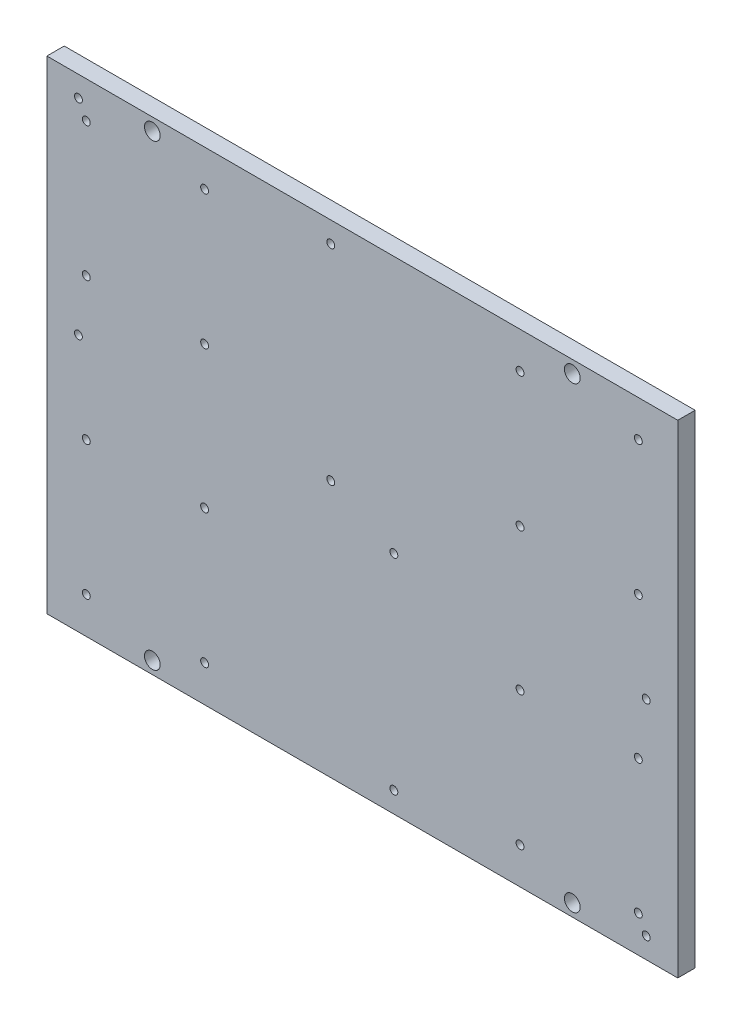
ISO-10303-21;
HEADER;
FILE_DESCRIPTION(('STEP AP214'),'2;1');
FILE_NAME('part.step','',(''),(''),'','','');
FILE_SCHEMA(('AUTOMOTIVE_DESIGN { 1 0 10303 214 1 1 1 1 }'));
ENDSEC;
DATA;
#1=APPLICATION_CONTEXT('core data for automotive mechanical design processes');
#2=APPLICATION_PROTOCOL_DEFINITION('international standard','automotive_design',2000,#1);
#3=PRODUCT_CONTEXT('',#1,'mechanical');
#4=PRODUCT('Part','Part','',(#3));
#5=PRODUCT_RELATED_PRODUCT_CATEGORY('part','',(#4));
#6=PRODUCT_DEFINITION_FORMATION('','',#4);
#7=PRODUCT_DEFINITION_CONTEXT('part definition',#1,'design');
#8=PRODUCT_DEFINITION('design','',#6,#7);
#9=PRODUCT_DEFINITION_SHAPE('','',#8);
#10=(LENGTH_UNIT() NAMED_UNIT(*) SI_UNIT(.MILLI.,.METRE.));
#11=(NAMED_UNIT(*) PLANE_ANGLE_UNIT() SI_UNIT($,.RADIAN.));
#12=(NAMED_UNIT(*) SI_UNIT($,.STERADIAN.) SOLID_ANGLE_UNIT());
#13=UNCERTAINTY_MEASURE_WITH_UNIT(LENGTH_MEASURE(1.E-05),#10,'distance_accuracy_value','');
#14=(GEOMETRIC_REPRESENTATION_CONTEXT(3) GLOBAL_UNCERTAINTY_ASSIGNED_CONTEXT((#13)) GLOBAL_UNIT_ASSIGNED_CONTEXT((#10,
#11,#12)) REPRESENTATION_CONTEXT('',''));
#15=CARTESIAN_POINT('',(0.,0.,0.));
#16=DIRECTION('',(0.,0.,1.));
#17=DIRECTION('',(1.,0.,0.));
#18=AXIS2_PLACEMENT_3D('',#15,#16,#17);
#19=CARTESIAN_POINT('',(101.6,-77.7875,5.588));
#20=DIRECTION('',(-1.,0.,0.));
#21=DIRECTION('',(0.,0.,1.));
#22=AXIS2_PLACEMENT_3D('',#19,#20,#21);
#23=PLANE('',#22);
#24=DIRECTION('',(0.,1.,0.));
#25=VECTOR('',#24,1.);
#26=CARTESIAN_POINT('',(101.6,-77.7875,0.));
#27=LINE('',#26,#25);
#28=CARTESIAN_POINT('',(101.6,-77.7875,0.));
#29=VERTEX_POINT('',#28);
#30=CARTESIAN_POINT('',(101.6,77.7875,0.));
#31=VERTEX_POINT('',#30);
#32=EDGE_CURVE('E94',#29,#31,#27,.T.);
#33=ORIENTED_EDGE('',*,*,#32,.T.);
#34=DIRECTION('',(0.,0.,-1.));
#35=VECTOR('',#34,1.);
#36=CARTESIAN_POINT('',(101.6,77.7875,5.588));
#37=LINE('',#36,#35);
#38=CARTESIAN_POINT('',(101.6,77.7875,5.588));
#39=VERTEX_POINT('',#38);
#40=EDGE_CURVE('E11',#39,#31,#37,.T.);
#41=ORIENTED_EDGE('',*,*,#40,.F.);
#42=DIRECTION('',(0.,1.,0.));
#43=VECTOR('',#42,1.);
#44=CARTESIAN_POINT('',(101.6,-77.7875,5.588));
#45=LINE('',#44,#43);
#46=CARTESIAN_POINT('',(101.6,-77.7875,5.588));
#47=VERTEX_POINT('',#46);
#48=EDGE_CURVE('E82',#47,#39,#45,.T.);
#49=ORIENTED_EDGE('',*,*,#48,.F.);
#50=DIRECTION('',(0.,0.,-1.));
#51=VECTOR('',#50,1.);
#52=CARTESIAN_POINT('',(101.6,-77.7875,5.588));
#53=LINE('',#52,#51);
#54=EDGE_CURVE('E90',#47,#29,#53,.T.);
#55=ORIENTED_EDGE('',*,*,#54,.T.);
#56=EDGE_LOOP('',(#33,#41,#49,#55));
#57=FACE_BOUND('',#56,.T.);
#58=ADVANCED_FACE('F31',(#57),#23,.F.);
#59=CARTESIAN_POINT('',(-101.6,77.7875,5.588));
#60=DIRECTION('',(0.,-1.,0.));
#61=DIRECTION('',(0.,0.,-1.));
#62=AXIS2_PLACEMENT_3D('',#59,#60,#61);
#63=PLANE('',#62);
#64=DIRECTION('',(-1.,0.,0.));
#65=VECTOR('',#64,1.);
#66=CARTESIAN_POINT('',(-101.6,77.7875,0.));
#67=LINE('',#66,#65);
#68=CARTESIAN_POINT('',(-101.6,77.7875,0.));
#69=VERTEX_POINT('',#68);
#70=EDGE_CURVE('E86',#31,#69,#67,.T.);
#71=ORIENTED_EDGE('',*,*,#70,.T.);
#72=DIRECTION('',(0.,0.,-1.));
#73=VECTOR('',#72,1.);
#74=CARTESIAN_POINT('',(-101.6,77.7875,5.588));
#75=LINE('',#74,#73);
#76=CARTESIAN_POINT('',(-101.6,77.7875,5.588));
#77=VERTEX_POINT('',#76);
#78=EDGE_CURVE('E39',#77,#69,#75,.T.);
#79=ORIENTED_EDGE('',*,*,#78,.F.);
#80=DIRECTION('',(-1.,0.,0.));
#81=VECTOR('',#80,1.);
#82=CARTESIAN_POINT('',(-101.6,77.7875,5.588));
#83=LINE('',#82,#81);
#84=EDGE_CURVE('E77',#39,#77,#83,.T.);
#85=ORIENTED_EDGE('',*,*,#84,.F.);
#86=ORIENTED_EDGE('',*,*,#40,.T.);
#87=EDGE_LOOP('',(#71,#79,#85,#86));
#88=FACE_BOUND('',#87,.T.);
#89=ADVANCED_FACE('F85',(#88),#63,.F.);
#90=CARTESIAN_POINT('',(-101.6,-77.7875,5.588));
#91=DIRECTION('',(1.,0.,0.));
#92=DIRECTION('',(0.,0.,-1.));
#93=AXIS2_PLACEMENT_3D('',#90,#91,#92);
#94=PLANE('',#93);
#95=DIRECTION('',(0.,-1.,0.));
#96=VECTOR('',#95,1.);
#97=CARTESIAN_POINT('',(-101.6,-77.7875,0.));
#98=LINE('',#97,#96);
#99=CARTESIAN_POINT('',(-101.6,-77.7875,0.));
#100=VERTEX_POINT('',#99);
#101=EDGE_CURVE('E64',#69,#100,#98,.T.);
#102=ORIENTED_EDGE('',*,*,#101,.T.);
#103=DIRECTION('',(0.,0.,-1.));
#104=VECTOR('',#103,1.);
#105=CARTESIAN_POINT('',(-101.6,-77.7875,5.588));
#106=LINE('',#105,#104);
#107=CARTESIAN_POINT('',(-101.6,-77.7875,5.588));
#108=VERTEX_POINT('',#107);
#109=EDGE_CURVE('E87',#108,#100,#106,.T.);
#110=ORIENTED_EDGE('',*,*,#109,.F.);
#111=DIRECTION('',(0.,-1.,0.));
#112=VECTOR('',#111,1.);
#113=CARTESIAN_POINT('',(-101.6,-77.7875,5.588));
#114=LINE('',#113,#112);
#115=EDGE_CURVE('E80',#77,#108,#114,.T.);
#116=ORIENTED_EDGE('',*,*,#115,.F.);
#117=ORIENTED_EDGE('',*,*,#78,.T.);
#118=EDGE_LOOP('',(#102,#110,#116,#117));
#119=FACE_BOUND('',#118,.T.);
#120=ADVANCED_FACE('F88',(#119),#94,.F.);
#121=CARTESIAN_POINT('',(-101.6,-77.7875,5.588));
#122=DIRECTION('',(0.,1.,0.));
#123=DIRECTION('',(0.,0.,1.));
#124=AXIS2_PLACEMENT_3D('',#121,#122,#123);
#125=PLANE('',#124);
#126=DIRECTION('',(1.,0.,0.));
#127=VECTOR('',#126,1.);
#128=CARTESIAN_POINT('',(-101.6,-77.7875,0.));
#129=LINE('',#128,#127);
#130=EDGE_CURVE('E70',#100,#29,#129,.T.);
#131=ORIENTED_EDGE('',*,*,#130,.T.);
#132=ORIENTED_EDGE('',*,*,#54,.F.);
#133=DIRECTION('',(1.,0.,0.));
#134=VECTOR('',#133,1.);
#135=CARTESIAN_POINT('',(-101.6,-77.7875,5.588));
#136=LINE('',#135,#134);
#137=EDGE_CURVE('E47',#108,#47,#136,.T.);
#138=ORIENTED_EDGE('',*,*,#137,.F.);
#139=ORIENTED_EDGE('',*,*,#109,.T.);
#140=EDGE_LOOP('',(#131,#132,#138,#139));
#141=FACE_BOUND('',#140,.T.);
#142=ADVANCED_FACE('F102',(#141),#125,.F.);
#143=CARTESIAN_POINT('',(101.6,77.7875,5.588));
#144=DIRECTION('',(0.,0.,-1.));
#145=DIRECTION('',(-1.,0.,0.));
#146=AXIS2_PLACEMENT_3D('',#143,#144,#145);
#147=PLANE('',#146);
#148=CARTESIAN_POINT('',(50.7999999999999,-22.86,5.588));
#149=DIRECTION('',(0.,0.,1.));
#150=DIRECTION('',(-1.,0.,0.));
#151=AXIS2_PLACEMENT_3D('',#148,#149,#150);
#152=CIRCLE('',#151,1.27);
#153=CARTESIAN_POINT('',(49.53,-22.86,5.588));
#154=VERTEX_POINT('',#153);
#155=EDGE_CURVE('E270',#154,#154,#152,.T.);
#156=ORIENTED_EDGE('',*,*,#155,.F.);
#157=EDGE_LOOP('',(#156));
#158=FACE_BOUND('',#157,.T.);
#159=CARTESIAN_POINT('',(50.8,-66.04,5.588));
#160=DIRECTION('',(0.,0.,1.));
#161=DIRECTION('',(-1.,0.,0.));
#162=AXIS2_PLACEMENT_3D('',#159,#160,#161);
#163=CIRCLE('',#162,1.27);
#164=CARTESIAN_POINT('',(49.53,-66.04,5.588));
#165=VERTEX_POINT('',#164);
#166=EDGE_CURVE('E264',#165,#165,#163,.T.);
#167=ORIENTED_EDGE('',*,*,#166,.F.);
#168=EDGE_LOOP('',(#167));
#169=FACE_BOUND('',#168,.T.);
#170=CARTESIAN_POINT('',(88.8999999999999,-66.04,5.588));
#171=DIRECTION('',(0.,0.,1.));
#172=DIRECTION('',(-1.,0.,0.));
#173=AXIS2_PLACEMENT_3D('',#170,#171,#172);
#174=CIRCLE('',#173,1.26999999999999);
#175=CARTESIAN_POINT('',(87.63,-66.04,5.588));
#176=VERTEX_POINT('',#175);
#177=EDGE_CURVE('E258',#176,#176,#174,.T.);
#178=ORIENTED_EDGE('',*,*,#177,.F.);
#179=EDGE_LOOP('',(#178));
#180=FACE_BOUND('',#179,.T.);
#181=CARTESIAN_POINT('',(88.8999999999999,22.86,5.588));
#182=DIRECTION('',(0.,0.,1.));
#183=DIRECTION('',(1.,0.,0.));
#184=AXIS2_PLACEMENT_3D('',#181,#182,#183);
#185=CIRCLE('',#184,1.26999999999999);
#186=CARTESIAN_POINT('',(90.1699999999999,22.86,5.588));
#187=VERTEX_POINT('',#186);
#188=EDGE_CURVE('E252',#187,#187,#185,.T.);
#189=ORIENTED_EDGE('',*,*,#188,.F.);
#190=EDGE_LOOP('',(#189));
#191=FACE_BOUND('',#190,.T.);
#192=CARTESIAN_POINT('',(-88.8999999999999,-22.8600000000001,5.588));
#193=DIRECTION('',(0.,0.,1.));
#194=DIRECTION('',(1.,0.,0.));
#195=AXIS2_PLACEMENT_3D('',#192,#193,#194);
#196=CIRCLE('',#195,1.26999999999999);
#197=CARTESIAN_POINT('',(-87.6299999999999,-22.8600000000001,5.588));
#198=VERTEX_POINT('',#197);
#199=EDGE_CURVE('E246',#198,#198,#196,.T.);
#200=ORIENTED_EDGE('',*,*,#199,.F.);
#201=EDGE_LOOP('',(#200));
#202=FACE_BOUND('',#201,.T.);
#203=CARTESIAN_POINT('',(-88.8999999999999,-66.04,5.588));
#204=DIRECTION('',(0.,0.,1.));
#205=DIRECTION('',(1.,0.,0.));
#206=AXIS2_PLACEMENT_3D('',#203,#204,#205);
#207=CIRCLE('',#206,1.26999999999999);
#208=CARTESIAN_POINT('',(-87.6299999999999,-66.04,5.588));
#209=VERTEX_POINT('',#208);
#210=EDGE_CURVE('E240',#209,#209,#207,.T.);
#211=ORIENTED_EDGE('',*,*,#210,.F.);
#212=EDGE_LOOP('',(#211));
#213=FACE_BOUND('',#212,.T.);
#214=CARTESIAN_POINT('',(-50.7999999999999,-66.04,5.588));
#215=DIRECTION('',(0.,0.,1.));
#216=DIRECTION('',(1.,0.,0.));
#217=AXIS2_PLACEMENT_3D('',#214,#215,#216);
#218=CIRCLE('',#217,1.27);
#219=CARTESIAN_POINT('',(-49.5299999999999,-66.04,5.588));
#220=VERTEX_POINT('',#219);
#221=EDGE_CURVE('E234',#220,#220,#218,.T.);
#222=ORIENTED_EDGE('',*,*,#221,.F.);
#223=EDGE_LOOP('',(#222));
#224=FACE_BOUND('',#223,.T.);
#225=CARTESIAN_POINT('',(-50.7999999999999,-22.86,5.588));
#226=DIRECTION('',(0.,0.,1.));
#227=DIRECTION('',(1.,0.,0.));
#228=AXIS2_PLACEMENT_3D('',#225,#226,#227);
#229=CIRCLE('',#228,1.27);
#230=CARTESIAN_POINT('',(-49.5299999999999,-22.86,5.588));
#231=VERTEX_POINT('',#230);
#232=EDGE_CURVE('E228',#231,#231,#229,.T.);
#233=ORIENTED_EDGE('',*,*,#232,.F.);
#234=EDGE_LOOP('',(#233));
#235=FACE_BOUND('',#234,.T.);
#236=CARTESIAN_POINT('',(88.8999999999999,-22.86,5.588));
#237=DIRECTION('',(0.,0.,1.));
#238=DIRECTION('',(-1.,0.,0.));
#239=AXIS2_PLACEMENT_3D('',#236,#237,#238);
#240=CIRCLE('',#239,1.26999999999999);
#241=CARTESIAN_POINT('',(87.6299999999999,-22.86,5.588));
#242=VERTEX_POINT('',#241);
#243=EDGE_CURVE('E222',#242,#242,#240,.T.);
#244=ORIENTED_EDGE('',*,*,#243,.F.);
#245=EDGE_LOOP('',(#244));
#246=FACE_BOUND('',#245,.T.);
#247=CARTESIAN_POINT('',(-50.7999999999999,22.86,5.588));
#248=DIRECTION('',(0.,0.,1.));
#249=DIRECTION('',(-1.,0.,0.));
#250=AXIS2_PLACEMENT_3D('',#247,#248,#249);
#251=CIRCLE('',#250,1.27);
#252=CARTESIAN_POINT('',(-52.0699999999999,22.86,5.588));
#253=VERTEX_POINT('',#252);
#254=EDGE_CURVE('E216',#253,#253,#251,.T.);
#255=ORIENTED_EDGE('',*,*,#254,.F.);
#256=EDGE_LOOP('',(#255));
#257=FACE_BOUND('',#256,.T.);
#258=CARTESIAN_POINT('',(-50.7999999999999,66.04,5.588));
#259=DIRECTION('',(0.,0.,1.));
#260=DIRECTION('',(-1.,0.,0.));
#261=AXIS2_PLACEMENT_3D('',#258,#259,#260);
#262=CIRCLE('',#261,1.27);
#263=CARTESIAN_POINT('',(-52.0699999999999,66.04,5.588));
#264=VERTEX_POINT('',#263);
#265=EDGE_CURVE('E210',#264,#264,#262,.T.);
#266=ORIENTED_EDGE('',*,*,#265,.F.);
#267=EDGE_LOOP('',(#266));
#268=FACE_BOUND('',#267,.T.);
#269=CARTESIAN_POINT('',(-88.8999999999999,66.04,5.588));
#270=DIRECTION('',(0.,0.,1.));
#271=DIRECTION('',(-1.,0.,0.));
#272=AXIS2_PLACEMENT_3D('',#269,#270,#271);
#273=CIRCLE('',#272,1.26999999999999);
#274=CARTESIAN_POINT('',(-90.1699999999999,66.04,5.588));
#275=VERTEX_POINT('',#274);
#276=EDGE_CURVE('E204',#275,#275,#273,.T.);
#277=ORIENTED_EDGE('',*,*,#276,.F.);
#278=EDGE_LOOP('',(#277));
#279=FACE_BOUND('',#278,.T.);
#280=CARTESIAN_POINT('',(-88.8999999999999,22.86,5.588));
#281=DIRECTION('',(0.,0.,1.));
#282=DIRECTION('',(-1.,0.,0.));
#283=AXIS2_PLACEMENT_3D('',#280,#281,#282);
#284=CIRCLE('',#283,1.26999999999999);
#285=CARTESIAN_POINT('',(-90.1699999999999,22.86,5.588));
#286=VERTEX_POINT('',#285);
#287=EDGE_CURVE('E198',#286,#286,#284,.T.);
#288=ORIENTED_EDGE('',*,*,#287,.F.);
#289=EDGE_LOOP('',(#288));
#290=FACE_BOUND('',#289,.T.);
#291=CARTESIAN_POINT('',(88.8999999999999,66.04,5.588));
#292=DIRECTION('',(0.,0.,1.));
#293=DIRECTION('',(1.,0.,0.));
#294=AXIS2_PLACEMENT_3D('',#291,#292,#293);
#295=CIRCLE('',#294,1.26999999999999);
#296=CARTESIAN_POINT('',(90.1699999999999,66.04,5.588));
#297=VERTEX_POINT('',#296);
#298=EDGE_CURVE('E192',#297,#297,#295,.T.);
#299=ORIENTED_EDGE('',*,*,#298,.F.);
#300=EDGE_LOOP('',(#299));
#301=FACE_BOUND('',#300,.T.);
#302=CARTESIAN_POINT('',(50.7999999999999,66.04,5.588));
#303=DIRECTION('',(0.,0.,1.));
#304=DIRECTION('',(1.,0.,0.));
#305=AXIS2_PLACEMENT_3D('',#302,#303,#304);
#306=CIRCLE('',#305,1.27);
#307=CARTESIAN_POINT('',(52.0699999999999,66.04,5.588));
#308=VERTEX_POINT('',#307);
#309=EDGE_CURVE('E186',#308,#308,#306,.T.);
#310=ORIENTED_EDGE('',*,*,#309,.F.);
#311=EDGE_LOOP('',(#310));
#312=FACE_BOUND('',#311,.T.);
#313=CARTESIAN_POINT('',(50.7999999999999,22.86,5.588));
#314=DIRECTION('',(0.,0.,1.));
#315=DIRECTION('',(1.,0.,0.));
#316=AXIS2_PLACEMENT_3D('',#313,#314,#315);
#317=CIRCLE('',#316,1.27);
#318=CARTESIAN_POINT('',(52.0699999999999,22.86,5.588));
#319=VERTEX_POINT('',#318);
#320=EDGE_CURVE('E180',#319,#319,#317,.T.);
#321=ORIENTED_EDGE('',*,*,#320,.F.);
#322=EDGE_LOOP('',(#321));
#323=FACE_BOUND('',#322,.T.);
#324=CARTESIAN_POINT('',(10.16,-71.12,5.588));
#325=DIRECTION('',(0.,0.,1.));
#326=DIRECTION('',(1.,0.,0.));
#327=AXIS2_PLACEMENT_3D('',#324,#325,#326);
#328=CIRCLE('',#327,1.27);
#329=CARTESIAN_POINT('',(11.43,-71.12,5.588));
#330=VERTEX_POINT('',#329);
#331=EDGE_CURVE('E174',#330,#330,#328,.T.);
#332=ORIENTED_EDGE('',*,*,#331,.F.);
#333=EDGE_LOOP('',(#332));
#334=FACE_BOUND('',#333,.T.);
#335=CARTESIAN_POINT('',(91.44,-71.12,5.588));
#336=DIRECTION('',(0.,0.,1.));
#337=DIRECTION('',(1.,0.,0.));
#338=AXIS2_PLACEMENT_3D('',#335,#336,#337);
#339=CIRCLE('',#338,1.27000000000001);
#340=CARTESIAN_POINT('',(92.71,-71.12,5.588));
#341=VERTEX_POINT('',#340);
#342=EDGE_CURVE('E168',#341,#341,#339,.T.);
#343=ORIENTED_EDGE('',*,*,#342,.F.);
#344=EDGE_LOOP('',(#343));
#345=FACE_BOUND('',#344,.T.);
#346=CARTESIAN_POINT('',(91.44,-5.08,5.588));
#347=DIRECTION('',(0.,0.,1.));
#348=DIRECTION('',(1.,0.,0.));
#349=AXIS2_PLACEMENT_3D('',#346,#347,#348);
#350=CIRCLE('',#349,1.27000000000001);
#351=CARTESIAN_POINT('',(92.71,-5.08,5.588));
#352=VERTEX_POINT('',#351);
#353=EDGE_CURVE('E162',#352,#352,#350,.T.);
#354=ORIENTED_EDGE('',*,*,#353,.F.);
#355=EDGE_LOOP('',(#354));
#356=FACE_BOUND('',#355,.T.);
#357=CARTESIAN_POINT('',(10.16,-5.08,5.588));
#358=DIRECTION('',(0.,0.,1.));
#359=DIRECTION('',(1.,0.,0.));
#360=AXIS2_PLACEMENT_3D('',#357,#358,#359);
#361=CIRCLE('',#360,1.26999999999999);
#362=CARTESIAN_POINT('',(11.43,-5.08,5.588));
#363=VERTEX_POINT('',#362);
#364=EDGE_CURVE('E156',#363,#363,#361,.T.);
#365=ORIENTED_EDGE('',*,*,#364,.F.);
#366=EDGE_LOOP('',(#365));
#367=FACE_BOUND('',#366,.T.);
#368=CARTESIAN_POINT('',(-91.44,5.08,5.588));
#369=DIRECTION('',(0.,0.,1.));
#370=DIRECTION('',(1.,0.,0.));
#371=AXIS2_PLACEMENT_3D('',#368,#369,#370);
#372=CIRCLE('',#371,1.26999999999999);
#373=CARTESIAN_POINT('',(-90.17,5.08,5.588));
#374=VERTEX_POINT('',#373);
#375=EDGE_CURVE('E150',#374,#374,#372,.T.);
#376=ORIENTED_EDGE('',*,*,#375,.F.);
#377=EDGE_LOOP('',(#376));
#378=FACE_BOUND('',#377,.T.);
#379=CARTESIAN_POINT('',(-10.16,5.08000000000001,5.588));
#380=DIRECTION('',(0.,0.,1.));
#381=DIRECTION('',(1.,0.,0.));
#382=AXIS2_PLACEMENT_3D('',#379,#380,#381);
#383=CIRCLE('',#382,1.27);
#384=CARTESIAN_POINT('',(-8.88999999999998,5.08000000000001,5.588));
#385=VERTEX_POINT('',#384);
#386=EDGE_CURVE('E144',#385,#385,#383,.T.);
#387=ORIENTED_EDGE('',*,*,#386,.F.);
#388=EDGE_LOOP('',(#387));
#389=FACE_BOUND('',#388,.T.);
#390=CARTESIAN_POINT('',(-10.16,71.12,5.588));
#391=DIRECTION('',(0.,0.,1.));
#392=DIRECTION('',(1.,0.,0.));
#393=AXIS2_PLACEMENT_3D('',#390,#391,#392);
#394=CIRCLE('',#393,1.27000000000001);
#395=CARTESIAN_POINT('',(-8.88999999999998,71.12,5.588));
#396=VERTEX_POINT('',#395);
#397=EDGE_CURVE('E138',#396,#396,#394,.T.);
#398=ORIENTED_EDGE('',*,*,#397,.F.);
#399=EDGE_LOOP('',(#398));
#400=FACE_BOUND('',#399,.T.);
#401=CARTESIAN_POINT('',(-91.44,71.12,5.588));
#402=DIRECTION('',(0.,0.,1.));
#403=DIRECTION('',(1.,0.,0.));
#404=AXIS2_PLACEMENT_3D('',#401,#402,#403);
#405=CIRCLE('',#404,1.26999999999999);
#406=CARTESIAN_POINT('',(-90.17,71.12,5.588));
#407=VERTEX_POINT('',#406);
#408=EDGE_CURVE('E132',#407,#407,#405,.T.);
#409=ORIENTED_EDGE('',*,*,#408,.F.);
#410=EDGE_LOOP('',(#409));
#411=FACE_BOUND('',#410,.T.);
#412=CARTESIAN_POINT('',(-67.6275,-73.787,5.588));
#413=DIRECTION('',(0.,0.,1.));
#414=DIRECTION('',(-1.,0.,0.));
#415=AXIS2_PLACEMENT_3D('',#412,#413,#414);
#416=CIRCLE('',#415,2.53999999999999);
#417=CARTESIAN_POINT('',(-70.1675,-73.787,5.588));
#418=VERTEX_POINT('',#417);
#419=EDGE_CURVE('E126',#418,#418,#416,.T.);
#420=ORIENTED_EDGE('',*,*,#419,.F.);
#421=EDGE_LOOP('',(#420));
#422=FACE_BOUND('',#421,.T.);
#423=CARTESIAN_POINT('',(67.6275,-73.787,5.588));
#424=DIRECTION('',(0.,0.,1.));
#425=DIRECTION('',(1.,0.,0.));
#426=AXIS2_PLACEMENT_3D('',#423,#424,#425);
#427=CIRCLE('',#426,2.53999999999999);
#428=CARTESIAN_POINT('',(70.1675,-73.787,5.588));
#429=VERTEX_POINT('',#428);
#430=EDGE_CURVE('E120',#429,#429,#427,.T.);
#431=ORIENTED_EDGE('',*,*,#430,.F.);
#432=EDGE_LOOP('',(#431));
#433=FACE_BOUND('',#432,.T.);
#434=CARTESIAN_POINT('',(67.6275,73.787,5.588));
#435=DIRECTION('',(0.,0.,1.));
#436=DIRECTION('',(-1.,0.,0.));
#437=AXIS2_PLACEMENT_3D('',#434,#435,#436);
#438=CIRCLE('',#437,2.53999999999999);
#439=CARTESIAN_POINT('',(65.0875,73.787,5.588));
#440=VERTEX_POINT('',#439);
#441=EDGE_CURVE('E114',#440,#440,#438,.T.);
#442=ORIENTED_EDGE('',*,*,#441,.F.);
#443=EDGE_LOOP('',(#442));
#444=FACE_BOUND('',#443,.T.);
#445=CARTESIAN_POINT('',(-67.6275,73.787,5.588));
#446=DIRECTION('',(0.,0.,1.));
#447=DIRECTION('',(1.,0.,0.));
#448=AXIS2_PLACEMENT_3D('',#445,#446,#447);
#449=CIRCLE('',#448,2.53999999999999);
#450=CARTESIAN_POINT('',(-65.0875,73.787,5.588));
#451=VERTEX_POINT('',#450);
#452=EDGE_CURVE('E108',#451,#451,#449,.T.);
#453=ORIENTED_EDGE('',*,*,#452,.F.);
#454=EDGE_LOOP('',(#453));
#455=FACE_BOUND('',#454,.T.);
#456=ORIENTED_EDGE('',*,*,#48,.T.);
#457=ORIENTED_EDGE('',*,*,#84,.T.);
#458=ORIENTED_EDGE('',*,*,#115,.T.);
#459=ORIENTED_EDGE('',*,*,#137,.T.);
#460=EDGE_LOOP('',(#456,#457,#458,#459));
#461=FACE_BOUND('',#460,.T.);
#462=ADVANCED_FACE('F78',(#158,#169,#180,#191,#202,#213,#224,#235,#246,#257,#268,#279,#290,#301,
#312,#323,#334,#345,#356,#367,#378,#389,#400,#411,#422,#433,#444,#455,#461),#147,.F.);
#463=CARTESIAN_POINT('',(101.6,77.7875,0.));
#464=DIRECTION('',(0.,0.,-1.));
#465=DIRECTION('',(-1.,0.,0.));
#466=AXIS2_PLACEMENT_3D('',#463,#464,#465);
#467=PLANE('',#466);
#468=CARTESIAN_POINT('',(50.7999999999999,-22.86,0.));
#469=DIRECTION('',(0.,0.,1.));
#470=DIRECTION('',(-1.,0.,0.));
#471=AXIS2_PLACEMENT_3D('',#468,#469,#470);
#472=CIRCLE('',#471,1.27);
#473=CARTESIAN_POINT('',(49.53,-22.86,0.));
#474=VERTEX_POINT('',#473);
#475=EDGE_CURVE('E267',#474,#474,#472,.T.);
#476=ORIENTED_EDGE('',*,*,#475,.T.);
#477=EDGE_LOOP('',(#476));
#478=FACE_BOUND('',#477,.T.);
#479=CARTESIAN_POINT('',(50.8,-66.04,0.));
#480=DIRECTION('',(0.,0.,1.));
#481=DIRECTION('',(-1.,0.,0.));
#482=AXIS2_PLACEMENT_3D('',#479,#480,#481);
#483=CIRCLE('',#482,1.27);
#484=CARTESIAN_POINT('',(49.53,-66.04,0.));
#485=VERTEX_POINT('',#484);
#486=EDGE_CURVE('E261',#485,#485,#483,.T.);
#487=ORIENTED_EDGE('',*,*,#486,.T.);
#488=EDGE_LOOP('',(#487));
#489=FACE_BOUND('',#488,.T.);
#490=CARTESIAN_POINT('',(88.8999999999999,-66.04,0.));
#491=DIRECTION('',(0.,0.,1.));
#492=DIRECTION('',(-1.,0.,0.));
#493=AXIS2_PLACEMENT_3D('',#490,#491,#492);
#494=CIRCLE('',#493,1.26999999999999);
#495=CARTESIAN_POINT('',(87.63,-66.04,0.));
#496=VERTEX_POINT('',#495);
#497=EDGE_CURVE('E255',#496,#496,#494,.T.);
#498=ORIENTED_EDGE('',*,*,#497,.T.);
#499=EDGE_LOOP('',(#498));
#500=FACE_BOUND('',#499,.T.);
#501=CARTESIAN_POINT('',(88.8999999999999,22.86,0.));
#502=DIRECTION('',(0.,0.,1.));
#503=DIRECTION('',(1.,0.,0.));
#504=AXIS2_PLACEMENT_3D('',#501,#502,#503);
#505=CIRCLE('',#504,1.26999999999999);
#506=CARTESIAN_POINT('',(90.1699999999999,22.86,0.));
#507=VERTEX_POINT('',#506);
#508=EDGE_CURVE('E249',#507,#507,#505,.T.);
#509=ORIENTED_EDGE('',*,*,#508,.T.);
#510=EDGE_LOOP('',(#509));
#511=FACE_BOUND('',#510,.T.);
#512=CARTESIAN_POINT('',(-88.8999999999999,-22.8600000000001,0.));
#513=DIRECTION('',(0.,0.,1.));
#514=DIRECTION('',(1.,0.,0.));
#515=AXIS2_PLACEMENT_3D('',#512,#513,#514);
#516=CIRCLE('',#515,1.26999999999999);
#517=CARTESIAN_POINT('',(-87.6299999999999,-22.8600000000001,0.));
#518=VERTEX_POINT('',#517);
#519=EDGE_CURVE('E243',#518,#518,#516,.T.);
#520=ORIENTED_EDGE('',*,*,#519,.T.);
#521=EDGE_LOOP('',(#520));
#522=FACE_BOUND('',#521,.T.);
#523=CARTESIAN_POINT('',(-88.8999999999999,-66.04,0.));
#524=DIRECTION('',(0.,0.,1.));
#525=DIRECTION('',(1.,0.,0.));
#526=AXIS2_PLACEMENT_3D('',#523,#524,#525);
#527=CIRCLE('',#526,1.26999999999999);
#528=CARTESIAN_POINT('',(-87.6299999999999,-66.04,0.));
#529=VERTEX_POINT('',#528);
#530=EDGE_CURVE('E237',#529,#529,#527,.T.);
#531=ORIENTED_EDGE('',*,*,#530,.T.);
#532=EDGE_LOOP('',(#531));
#533=FACE_BOUND('',#532,.T.);
#534=CARTESIAN_POINT('',(-50.7999999999999,-66.04,0.));
#535=DIRECTION('',(0.,0.,1.));
#536=DIRECTION('',(1.,0.,0.));
#537=AXIS2_PLACEMENT_3D('',#534,#535,#536);
#538=CIRCLE('',#537,1.27);
#539=CARTESIAN_POINT('',(-49.5299999999999,-66.04,0.));
#540=VERTEX_POINT('',#539);
#541=EDGE_CURVE('E231',#540,#540,#538,.T.);
#542=ORIENTED_EDGE('',*,*,#541,.T.);
#543=EDGE_LOOP('',(#542));
#544=FACE_BOUND('',#543,.T.);
#545=CARTESIAN_POINT('',(-50.7999999999999,-22.86,0.));
#546=DIRECTION('',(0.,0.,1.));
#547=DIRECTION('',(1.,0.,0.));
#548=AXIS2_PLACEMENT_3D('',#545,#546,#547);
#549=CIRCLE('',#548,1.27);
#550=CARTESIAN_POINT('',(-49.5299999999999,-22.86,0.));
#551=VERTEX_POINT('',#550);
#552=EDGE_CURVE('E225',#551,#551,#549,.T.);
#553=ORIENTED_EDGE('',*,*,#552,.T.);
#554=EDGE_LOOP('',(#553));
#555=FACE_BOUND('',#554,.T.);
#556=CARTESIAN_POINT('',(88.8999999999999,-22.86,0.));
#557=DIRECTION('',(0.,0.,1.));
#558=DIRECTION('',(-1.,0.,0.));
#559=AXIS2_PLACEMENT_3D('',#556,#557,#558);
#560=CIRCLE('',#559,1.26999999999999);
#561=CARTESIAN_POINT('',(87.6299999999999,-22.86,0.));
#562=VERTEX_POINT('',#561);
#563=EDGE_CURVE('E219',#562,#562,#560,.T.);
#564=ORIENTED_EDGE('',*,*,#563,.T.);
#565=EDGE_LOOP('',(#564));
#566=FACE_BOUND('',#565,.T.);
#567=CARTESIAN_POINT('',(-50.7999999999999,22.86,0.));
#568=DIRECTION('',(0.,0.,1.));
#569=DIRECTION('',(-1.,0.,0.));
#570=AXIS2_PLACEMENT_3D('',#567,#568,#569);
#571=CIRCLE('',#570,1.27);
#572=CARTESIAN_POINT('',(-52.0699999999999,22.86,0.));
#573=VERTEX_POINT('',#572);
#574=EDGE_CURVE('E213',#573,#573,#571,.T.);
#575=ORIENTED_EDGE('',*,*,#574,.T.);
#576=EDGE_LOOP('',(#575));
#577=FACE_BOUND('',#576,.T.);
#578=CARTESIAN_POINT('',(-50.7999999999999,66.04,0.));
#579=DIRECTION('',(0.,0.,1.));
#580=DIRECTION('',(-1.,0.,0.));
#581=AXIS2_PLACEMENT_3D('',#578,#579,#580);
#582=CIRCLE('',#581,1.27);
#583=CARTESIAN_POINT('',(-52.0699999999999,66.04,0.));
#584=VERTEX_POINT('',#583);
#585=EDGE_CURVE('E207',#584,#584,#582,.T.);
#586=ORIENTED_EDGE('',*,*,#585,.T.);
#587=EDGE_LOOP('',(#586));
#588=FACE_BOUND('',#587,.T.);
#589=CARTESIAN_POINT('',(-88.8999999999999,66.04,0.));
#590=DIRECTION('',(0.,0.,1.));
#591=DIRECTION('',(-1.,0.,0.));
#592=AXIS2_PLACEMENT_3D('',#589,#590,#591);
#593=CIRCLE('',#592,1.26999999999999);
#594=CARTESIAN_POINT('',(-90.1699999999999,66.04,0.));
#595=VERTEX_POINT('',#594);
#596=EDGE_CURVE('E201',#595,#595,#593,.T.);
#597=ORIENTED_EDGE('',*,*,#596,.T.);
#598=EDGE_LOOP('',(#597));
#599=FACE_BOUND('',#598,.T.);
#600=CARTESIAN_POINT('',(-88.8999999999999,22.86,0.));
#601=DIRECTION('',(0.,0.,1.));
#602=DIRECTION('',(-1.,0.,0.));
#603=AXIS2_PLACEMENT_3D('',#600,#601,#602);
#604=CIRCLE('',#603,1.26999999999999);
#605=CARTESIAN_POINT('',(-90.1699999999999,22.86,0.));
#606=VERTEX_POINT('',#605);
#607=EDGE_CURVE('E195',#606,#606,#604,.T.);
#608=ORIENTED_EDGE('',*,*,#607,.T.);
#609=EDGE_LOOP('',(#608));
#610=FACE_BOUND('',#609,.T.);
#611=CARTESIAN_POINT('',(88.8999999999999,66.04,0.));
#612=DIRECTION('',(0.,0.,1.));
#613=DIRECTION('',(1.,0.,0.));
#614=AXIS2_PLACEMENT_3D('',#611,#612,#613);
#615=CIRCLE('',#614,1.26999999999999);
#616=CARTESIAN_POINT('',(90.1699999999999,66.04,0.));
#617=VERTEX_POINT('',#616);
#618=EDGE_CURVE('E189',#617,#617,#615,.T.);
#619=ORIENTED_EDGE('',*,*,#618,.T.);
#620=EDGE_LOOP('',(#619));
#621=FACE_BOUND('',#620,.T.);
#622=CARTESIAN_POINT('',(50.7999999999999,66.04,0.));
#623=DIRECTION('',(0.,0.,1.));
#624=DIRECTION('',(1.,0.,0.));
#625=AXIS2_PLACEMENT_3D('',#622,#623,#624);
#626=CIRCLE('',#625,1.27);
#627=CARTESIAN_POINT('',(52.0699999999999,66.04,0.));
#628=VERTEX_POINT('',#627);
#629=EDGE_CURVE('E183',#628,#628,#626,.T.);
#630=ORIENTED_EDGE('',*,*,#629,.T.);
#631=EDGE_LOOP('',(#630));
#632=FACE_BOUND('',#631,.T.);
#633=CARTESIAN_POINT('',(50.7999999999999,22.86,0.));
#634=DIRECTION('',(0.,0.,1.));
#635=DIRECTION('',(1.,0.,0.));
#636=AXIS2_PLACEMENT_3D('',#633,#634,#635);
#637=CIRCLE('',#636,1.27);
#638=CARTESIAN_POINT('',(52.0699999999999,22.86,0.));
#639=VERTEX_POINT('',#638);
#640=EDGE_CURVE('E177',#639,#639,#637,.T.);
#641=ORIENTED_EDGE('',*,*,#640,.T.);
#642=EDGE_LOOP('',(#641));
#643=FACE_BOUND('',#642,.T.);
#644=CARTESIAN_POINT('',(10.16,-71.12,0.));
#645=DIRECTION('',(0.,0.,1.));
#646=DIRECTION('',(1.,0.,0.));
#647=AXIS2_PLACEMENT_3D('',#644,#645,#646);
#648=CIRCLE('',#647,1.27);
#649=CARTESIAN_POINT('',(11.43,-71.12,0.));
#650=VERTEX_POINT('',#649);
#651=EDGE_CURVE('E171',#650,#650,#648,.T.);
#652=ORIENTED_EDGE('',*,*,#651,.T.);
#653=EDGE_LOOP('',(#652));
#654=FACE_BOUND('',#653,.T.);
#655=CARTESIAN_POINT('',(91.44,-71.12,0.));
#656=DIRECTION('',(0.,0.,1.));
#657=DIRECTION('',(1.,0.,0.));
#658=AXIS2_PLACEMENT_3D('',#655,#656,#657);
#659=CIRCLE('',#658,1.27000000000001);
#660=CARTESIAN_POINT('',(92.71,-71.12,0.));
#661=VERTEX_POINT('',#660);
#662=EDGE_CURVE('E165',#661,#661,#659,.T.);
#663=ORIENTED_EDGE('',*,*,#662,.T.);
#664=EDGE_LOOP('',(#663));
#665=FACE_BOUND('',#664,.T.);
#666=CARTESIAN_POINT('',(91.44,-5.08,0.));
#667=DIRECTION('',(0.,0.,1.));
#668=DIRECTION('',(1.,0.,0.));
#669=AXIS2_PLACEMENT_3D('',#666,#667,#668);
#670=CIRCLE('',#669,1.27000000000001);
#671=CARTESIAN_POINT('',(92.71,-5.08,0.));
#672=VERTEX_POINT('',#671);
#673=EDGE_CURVE('E159',#672,#672,#670,.T.);
#674=ORIENTED_EDGE('',*,*,#673,.T.);
#675=EDGE_LOOP('',(#674));
#676=FACE_BOUND('',#675,.T.);
#677=CARTESIAN_POINT('',(10.16,-5.08,0.));
#678=DIRECTION('',(0.,0.,1.));
#679=DIRECTION('',(1.,0.,0.));
#680=AXIS2_PLACEMENT_3D('',#677,#678,#679);
#681=CIRCLE('',#680,1.26999999999999);
#682=CARTESIAN_POINT('',(11.43,-5.08,0.));
#683=VERTEX_POINT('',#682);
#684=EDGE_CURVE('E153',#683,#683,#681,.T.);
#685=ORIENTED_EDGE('',*,*,#684,.T.);
#686=EDGE_LOOP('',(#685));
#687=FACE_BOUND('',#686,.T.);
#688=CARTESIAN_POINT('',(-91.44,5.08,0.));
#689=DIRECTION('',(0.,0.,1.));
#690=DIRECTION('',(1.,0.,0.));
#691=AXIS2_PLACEMENT_3D('',#688,#689,#690);
#692=CIRCLE('',#691,1.26999999999999);
#693=CARTESIAN_POINT('',(-90.17,5.08,0.));
#694=VERTEX_POINT('',#693);
#695=EDGE_CURVE('E147',#694,#694,#692,.T.);
#696=ORIENTED_EDGE('',*,*,#695,.T.);
#697=EDGE_LOOP('',(#696));
#698=FACE_BOUND('',#697,.T.);
#699=CARTESIAN_POINT('',(-10.16,5.08000000000001,0.));
#700=DIRECTION('',(0.,0.,1.));
#701=DIRECTION('',(1.,0.,0.));
#702=AXIS2_PLACEMENT_3D('',#699,#700,#701);
#703=CIRCLE('',#702,1.27);
#704=CARTESIAN_POINT('',(-8.88999999999998,5.08000000000001,0.));
#705=VERTEX_POINT('',#704);
#706=EDGE_CURVE('E141',#705,#705,#703,.T.);
#707=ORIENTED_EDGE('',*,*,#706,.T.);
#708=EDGE_LOOP('',(#707));
#709=FACE_BOUND('',#708,.T.);
#710=CARTESIAN_POINT('',(-10.16,71.12,0.));
#711=DIRECTION('',(0.,0.,1.));
#712=DIRECTION('',(1.,0.,0.));
#713=AXIS2_PLACEMENT_3D('',#710,#711,#712);
#714=CIRCLE('',#713,1.27000000000001);
#715=CARTESIAN_POINT('',(-8.88999999999998,71.12,0.));
#716=VERTEX_POINT('',#715);
#717=EDGE_CURVE('E135',#716,#716,#714,.T.);
#718=ORIENTED_EDGE('',*,*,#717,.T.);
#719=EDGE_LOOP('',(#718));
#720=FACE_BOUND('',#719,.T.);
#721=CARTESIAN_POINT('',(-91.44,71.12,0.));
#722=DIRECTION('',(0.,0.,1.));
#723=DIRECTION('',(1.,0.,0.));
#724=AXIS2_PLACEMENT_3D('',#721,#722,#723);
#725=CIRCLE('',#724,1.26999999999999);
#726=CARTESIAN_POINT('',(-90.17,71.12,0.));
#727=VERTEX_POINT('',#726);
#728=EDGE_CURVE('E129',#727,#727,#725,.T.);
#729=ORIENTED_EDGE('',*,*,#728,.T.);
#730=EDGE_LOOP('',(#729));
#731=FACE_BOUND('',#730,.T.);
#732=CARTESIAN_POINT('',(-67.6275,-73.787,0.));
#733=DIRECTION('',(0.,0.,1.));
#734=DIRECTION('',(-1.,0.,0.));
#735=AXIS2_PLACEMENT_3D('',#732,#733,#734);
#736=CIRCLE('',#735,2.53999999999999);
#737=CARTESIAN_POINT('',(-70.1675,-73.787,0.));
#738=VERTEX_POINT('',#737);
#739=EDGE_CURVE('E123',#738,#738,#736,.T.);
#740=ORIENTED_EDGE('',*,*,#739,.T.);
#741=EDGE_LOOP('',(#740));
#742=FACE_BOUND('',#741,.T.);
#743=CARTESIAN_POINT('',(67.6275,-73.787,0.));
#744=DIRECTION('',(0.,0.,1.));
#745=DIRECTION('',(1.,0.,0.));
#746=AXIS2_PLACEMENT_3D('',#743,#744,#745);
#747=CIRCLE('',#746,2.53999999999999);
#748=CARTESIAN_POINT('',(70.1675,-73.787,0.));
#749=VERTEX_POINT('',#748);
#750=EDGE_CURVE('E117',#749,#749,#747,.T.);
#751=ORIENTED_EDGE('',*,*,#750,.T.);
#752=EDGE_LOOP('',(#751));
#753=FACE_BOUND('',#752,.T.);
#754=CARTESIAN_POINT('',(67.6275,73.787,0.));
#755=DIRECTION('',(0.,0.,1.));
#756=DIRECTION('',(-1.,0.,0.));
#757=AXIS2_PLACEMENT_3D('',#754,#755,#756);
#758=CIRCLE('',#757,2.53999999999999);
#759=CARTESIAN_POINT('',(65.0875,73.787,0.));
#760=VERTEX_POINT('',#759);
#761=EDGE_CURVE('E111',#760,#760,#758,.T.);
#762=ORIENTED_EDGE('',*,*,#761,.T.);
#763=EDGE_LOOP('',(#762));
#764=FACE_BOUND('',#763,.T.);
#765=CARTESIAN_POINT('',(-67.6275,73.787,0.));
#766=DIRECTION('',(0.,0.,1.));
#767=DIRECTION('',(1.,0.,0.));
#768=AXIS2_PLACEMENT_3D('',#765,#766,#767);
#769=CIRCLE('',#768,2.53999999999999);
#770=CARTESIAN_POINT('',(-65.0875,73.787,0.));
#771=VERTEX_POINT('',#770);
#772=EDGE_CURVE('E97',#771,#771,#769,.T.);
#773=ORIENTED_EDGE('',*,*,#772,.T.);
#774=EDGE_LOOP('',(#773));
#775=FACE_BOUND('',#774,.T.);
#776=ORIENTED_EDGE('',*,*,#32,.F.);
#777=ORIENTED_EDGE('',*,*,#130,.F.);
#778=ORIENTED_EDGE('',*,*,#101,.F.);
#779=ORIENTED_EDGE('',*,*,#70,.F.);
#780=EDGE_LOOP('',(#776,#777,#778,#779));
#781=FACE_BOUND('',#780,.T.);
#782=ADVANCED_FACE('F105',(#478,#489,#500,#511,#522,#533,#544,#555,#566,#577,#588,#599,#610,
#621,#632,#643,#654,#665,#676,#687,#698,#709,#720,#731,#742,#753,#764,#775,#781),#467,.T.);
#783=CARTESIAN_POINT('',(-67.6275,73.787,0.));
#784=DIRECTION('',(0.,0.,1.));
#785=DIRECTION('',(1.,0.,0.));
#786=AXIS2_PLACEMENT_3D('',#783,#784,#785);
#787=CYLINDRICAL_SURFACE('',#786,2.53999999999999);
#788=ORIENTED_EDGE('',*,*,#772,.F.);
#789=EDGE_LOOP('',(#788));
#790=FACE_BOUND('',#789,.T.);
#791=ORIENTED_EDGE('',*,*,#452,.T.);
#792=EDGE_LOOP('',(#791));
#793=FACE_BOUND('',#792,.T.);
#794=ADVANCED_FACE('F342',(#790,#793),#787,.F.);
#795=CARTESIAN_POINT('',(67.6275,73.787,0.));
#796=DIRECTION('',(0.,0.,1.));
#797=DIRECTION('',(1.,0.,0.));
#798=AXIS2_PLACEMENT_3D('',#795,#796,#797);
#799=CYLINDRICAL_SURFACE('',#798,2.53999999999999);
#800=ORIENTED_EDGE('',*,*,#761,.F.);
#801=EDGE_LOOP('',(#800));
#802=FACE_BOUND('',#801,.T.);
#803=ORIENTED_EDGE('',*,*,#441,.T.);
#804=EDGE_LOOP('',(#803));
#805=FACE_BOUND('',#804,.T.);
#806=ADVANCED_FACE('F344',(#802,#805),#799,.F.);
#807=CARTESIAN_POINT('',(67.6275,-73.787,0.));
#808=DIRECTION('',(0.,0.,1.));
#809=DIRECTION('',(1.,0.,0.));
#810=AXIS2_PLACEMENT_3D('',#807,#808,#809);
#811=CYLINDRICAL_SURFACE('',#810,2.53999999999999);
#812=ORIENTED_EDGE('',*,*,#750,.F.);
#813=EDGE_LOOP('',(#812));
#814=FACE_BOUND('',#813,.T.);
#815=ORIENTED_EDGE('',*,*,#430,.T.);
#816=EDGE_LOOP('',(#815));
#817=FACE_BOUND('',#816,.T.);
#818=ADVANCED_FACE('F351',(#814,#817),#811,.F.);
#819=CARTESIAN_POINT('',(-67.6275,-73.787,0.));
#820=DIRECTION('',(0.,0.,1.));
#821=DIRECTION('',(1.,0.,0.));
#822=AXIS2_PLACEMENT_3D('',#819,#820,#821);
#823=CYLINDRICAL_SURFACE('',#822,2.53999999999999);
#824=ORIENTED_EDGE('',*,*,#739,.F.);
#825=EDGE_LOOP('',(#824));
#826=FACE_BOUND('',#825,.T.);
#827=ORIENTED_EDGE('',*,*,#419,.T.);
#828=EDGE_LOOP('',(#827));
#829=FACE_BOUND('',#828,.T.);
#830=ADVANCED_FACE('F574',(#826,#829),#823,.F.);
#831=CARTESIAN_POINT('',(-91.44,71.12,0.));
#832=DIRECTION('',(0.,0.,1.));
#833=DIRECTION('',(1.,0.,0.));
#834=AXIS2_PLACEMENT_3D('',#831,#832,#833);
#835=CYLINDRICAL_SURFACE('',#834,1.26999999999999);
#836=ORIENTED_EDGE('',*,*,#728,.F.);
#837=EDGE_LOOP('',(#836));
#838=FACE_BOUND('',#837,.T.);
#839=ORIENTED_EDGE('',*,*,#408,.T.);
#840=EDGE_LOOP('',(#839));
#841=FACE_BOUND('',#840,.T.);
#842=ADVANCED_FACE('F570',(#838,#841),#835,.F.);
#843=CARTESIAN_POINT('',(-10.16,71.12,0.));
#844=DIRECTION('',(0.,0.,1.));
#845=DIRECTION('',(1.,0.,0.));
#846=AXIS2_PLACEMENT_3D('',#843,#844,#845);
#847=CYLINDRICAL_SURFACE('',#846,1.27000000000001);
#848=ORIENTED_EDGE('',*,*,#717,.F.);
#849=EDGE_LOOP('',(#848));
#850=FACE_BOUND('',#849,.T.);
#851=ORIENTED_EDGE('',*,*,#397,.T.);
#852=EDGE_LOOP('',(#851));
#853=FACE_BOUND('',#852,.T.);
#854=ADVANCED_FACE('F566',(#850,#853),#847,.F.);
#855=CARTESIAN_POINT('',(-10.16,5.08000000000001,0.));
#856=DIRECTION('',(0.,0.,1.));
#857=DIRECTION('',(1.,0.,0.));
#858=AXIS2_PLACEMENT_3D('',#855,#856,#857);
#859=CYLINDRICAL_SURFACE('',#858,1.27);
#860=ORIENTED_EDGE('',*,*,#706,.F.);
#861=EDGE_LOOP('',(#860));
#862=FACE_BOUND('',#861,.T.);
#863=ORIENTED_EDGE('',*,*,#386,.T.);
#864=EDGE_LOOP('',(#863));
#865=FACE_BOUND('',#864,.T.);
#866=ADVANCED_FACE('F562',(#862,#865),#859,.F.);
#867=CARTESIAN_POINT('',(-91.44,5.08,0.));
#868=DIRECTION('',(0.,0.,1.));
#869=DIRECTION('',(1.,0.,0.));
#870=AXIS2_PLACEMENT_3D('',#867,#868,#869);
#871=CYLINDRICAL_SURFACE('',#870,1.26999999999999);
#872=ORIENTED_EDGE('',*,*,#695,.F.);
#873=EDGE_LOOP('',(#872));
#874=FACE_BOUND('',#873,.T.);
#875=ORIENTED_EDGE('',*,*,#375,.T.);
#876=EDGE_LOOP('',(#875));
#877=FACE_BOUND('',#876,.T.);
#878=ADVANCED_FACE('F558',(#874,#877),#871,.F.);
#879=CARTESIAN_POINT('',(10.16,-5.08,0.));
#880=DIRECTION('',(0.,0.,1.));
#881=DIRECTION('',(1.,0.,0.));
#882=AXIS2_PLACEMENT_3D('',#879,#880,#881);
#883=CYLINDRICAL_SURFACE('',#882,1.26999999999999);
#884=ORIENTED_EDGE('',*,*,#684,.F.);
#885=EDGE_LOOP('',(#884));
#886=FACE_BOUND('',#885,.T.);
#887=ORIENTED_EDGE('',*,*,#364,.T.);
#888=EDGE_LOOP('',(#887));
#889=FACE_BOUND('',#888,.T.);
#890=ADVANCED_FACE('F554',(#886,#889),#883,.F.);
#891=CARTESIAN_POINT('',(91.44,-5.08,0.));
#892=DIRECTION('',(0.,0.,1.));
#893=DIRECTION('',(1.,0.,0.));
#894=AXIS2_PLACEMENT_3D('',#891,#892,#893);
#895=CYLINDRICAL_SURFACE('',#894,1.27000000000001);
#896=ORIENTED_EDGE('',*,*,#673,.F.);
#897=EDGE_LOOP('',(#896));
#898=FACE_BOUND('',#897,.T.);
#899=ORIENTED_EDGE('',*,*,#353,.T.);
#900=EDGE_LOOP('',(#899));
#901=FACE_BOUND('',#900,.T.);
#902=ADVANCED_FACE('F550',(#898,#901),#895,.F.);
#903=CARTESIAN_POINT('',(91.44,-71.12,0.));
#904=DIRECTION('',(0.,0.,1.));
#905=DIRECTION('',(1.,0.,0.));
#906=AXIS2_PLACEMENT_3D('',#903,#904,#905);
#907=CYLINDRICAL_SURFACE('',#906,1.27000000000001);
#908=ORIENTED_EDGE('',*,*,#662,.F.);
#909=EDGE_LOOP('',(#908));
#910=FACE_BOUND('',#909,.T.);
#911=ORIENTED_EDGE('',*,*,#342,.T.);
#912=EDGE_LOOP('',(#911));
#913=FACE_BOUND('',#912,.T.);
#914=ADVANCED_FACE('F546',(#910,#913),#907,.F.);
#915=CARTESIAN_POINT('',(10.16,-71.12,0.));
#916=DIRECTION('',(0.,0.,1.));
#917=DIRECTION('',(1.,0.,0.));
#918=AXIS2_PLACEMENT_3D('',#915,#916,#917);
#919=CYLINDRICAL_SURFACE('',#918,1.27);
#920=ORIENTED_EDGE('',*,*,#651,.F.);
#921=EDGE_LOOP('',(#920));
#922=FACE_BOUND('',#921,.T.);
#923=ORIENTED_EDGE('',*,*,#331,.T.);
#924=EDGE_LOOP('',(#923));
#925=FACE_BOUND('',#924,.T.);
#926=ADVANCED_FACE('F391',(#922,#925),#919,.F.);
#927=CARTESIAN_POINT('',(50.7999999999999,22.86,0.));
#928=DIRECTION('',(0.,0.,1.));
#929=DIRECTION('',(1.,0.,0.));
#930=AXIS2_PLACEMENT_3D('',#927,#928,#929);
#931=CYLINDRICAL_SURFACE('',#930,1.27);
#932=ORIENTED_EDGE('',*,*,#640,.F.);
#933=EDGE_LOOP('',(#932));
#934=FACE_BOUND('',#933,.T.);
#935=ORIENTED_EDGE('',*,*,#320,.T.);
#936=EDGE_LOOP('',(#935));
#937=FACE_BOUND('',#936,.T.);
#938=ADVANCED_FACE('F385',(#934,#937),#931,.F.);
#939=CARTESIAN_POINT('',(50.7999999999999,66.04,0.));
#940=DIRECTION('',(0.,0.,1.));
#941=DIRECTION('',(1.,0.,0.));
#942=AXIS2_PLACEMENT_3D('',#939,#940,#941);
#943=CYLINDRICAL_SURFACE('',#942,1.27);
#944=ORIENTED_EDGE('',*,*,#629,.F.);
#945=EDGE_LOOP('',(#944));
#946=FACE_BOUND('',#945,.T.);
#947=ORIENTED_EDGE('',*,*,#309,.T.);
#948=EDGE_LOOP('',(#947));
#949=FACE_BOUND('',#948,.T.);
#950=ADVANCED_FACE('F390',(#946,#949),#943,.F.);
#951=CARTESIAN_POINT('',(88.8999999999999,66.04,0.));
#952=DIRECTION('',(0.,0.,1.));
#953=DIRECTION('',(1.,0.,0.));
#954=AXIS2_PLACEMENT_3D('',#951,#952,#953);
#955=CYLINDRICAL_SURFACE('',#954,1.26999999999999);
#956=ORIENTED_EDGE('',*,*,#618,.F.);
#957=EDGE_LOOP('',(#956));
#958=FACE_BOUND('',#957,.T.);
#959=ORIENTED_EDGE('',*,*,#298,.T.);
#960=EDGE_LOOP('',(#959));
#961=FACE_BOUND('',#960,.T.);
#962=ADVANCED_FACE('F403',(#958,#961),#955,.F.);
#963=CARTESIAN_POINT('',(-88.8999999999999,22.86,0.));
#964=DIRECTION('',(0.,0.,1.));
#965=DIRECTION('',(1.,0.,0.));
#966=AXIS2_PLACEMENT_3D('',#963,#964,#965);
#967=CYLINDRICAL_SURFACE('',#966,1.26999999999999);
#968=ORIENTED_EDGE('',*,*,#607,.F.);
#969=EDGE_LOOP('',(#968));
#970=FACE_BOUND('',#969,.T.);
#971=ORIENTED_EDGE('',*,*,#287,.T.);
#972=EDGE_LOOP('',(#971));
#973=FACE_BOUND('',#972,.T.);
#974=ADVANCED_FACE('F413',(#970,#973),#967,.F.);
#975=CARTESIAN_POINT('',(-88.8999999999999,66.04,0.));
#976=DIRECTION('',(0.,0.,1.));
#977=DIRECTION('',(1.,0.,0.));
#978=AXIS2_PLACEMENT_3D('',#975,#976,#977);
#979=CYLINDRICAL_SURFACE('',#978,1.26999999999999);
#980=ORIENTED_EDGE('',*,*,#596,.F.);
#981=EDGE_LOOP('',(#980));
#982=FACE_BOUND('',#981,.T.);
#983=ORIENTED_EDGE('',*,*,#276,.T.);
#984=EDGE_LOOP('',(#983));
#985=FACE_BOUND('',#984,.T.);
#986=ADVANCED_FACE('F423',(#982,#985),#979,.F.);
#987=CARTESIAN_POINT('',(-50.7999999999999,66.04,0.));
#988=DIRECTION('',(0.,0.,1.));
#989=DIRECTION('',(1.,0.,0.));
#990=AXIS2_PLACEMENT_3D('',#987,#988,#989);
#991=CYLINDRICAL_SURFACE('',#990,1.27);
#992=ORIENTED_EDGE('',*,*,#585,.F.);
#993=EDGE_LOOP('',(#992));
#994=FACE_BOUND('',#993,.T.);
#995=ORIENTED_EDGE('',*,*,#265,.T.);
#996=EDGE_LOOP('',(#995));
#997=FACE_BOUND('',#996,.T.);
#998=ADVANCED_FACE('F433',(#994,#997),#991,.F.);
#999=CARTESIAN_POINT('',(-50.7999999999999,22.86,0.));
#1000=DIRECTION('',(0.,0.,1.));
#1001=DIRECTION('',(1.,0.,0.));
#1002=AXIS2_PLACEMENT_3D('',#999,#1000,#1001);
#1003=CYLINDRICAL_SURFACE('',#1002,1.27);
#1004=ORIENTED_EDGE('',*,*,#574,.F.);
#1005=EDGE_LOOP('',(#1004));
#1006=FACE_BOUND('',#1005,.T.);
#1007=ORIENTED_EDGE('',*,*,#254,.T.);
#1008=EDGE_LOOP('',(#1007));
#1009=FACE_BOUND('',#1008,.T.);
#1010=ADVANCED_FACE('F443',(#1006,#1009),#1003,.F.);
#1011=CARTESIAN_POINT('',(88.8999999999999,-22.86,0.));
#1012=DIRECTION('',(0.,0.,1.));
#1013=DIRECTION('',(1.,0.,0.));
#1014=AXIS2_PLACEMENT_3D('',#1011,#1012,#1013);
#1015=CYLINDRICAL_SURFACE('',#1014,1.26999999999999);
#1016=ORIENTED_EDGE('',*,*,#563,.F.);
#1017=EDGE_LOOP('',(#1016));
#1018=FACE_BOUND('',#1017,.T.);
#1019=ORIENTED_EDGE('',*,*,#243,.T.);
#1020=EDGE_LOOP('',(#1019));
#1021=FACE_BOUND('',#1020,.T.);
#1022=ADVANCED_FACE('F453',(#1018,#1021),#1015,.F.);
#1023=CARTESIAN_POINT('',(-50.7999999999999,-22.86,0.));
#1024=DIRECTION('',(0.,0.,1.));
#1025=DIRECTION('',(1.,0.,0.));
#1026=AXIS2_PLACEMENT_3D('',#1023,#1024,#1025);
#1027=CYLINDRICAL_SURFACE('',#1026,1.27);
#1028=ORIENTED_EDGE('',*,*,#552,.F.);
#1029=EDGE_LOOP('',(#1028));
#1030=FACE_BOUND('',#1029,.T.);
#1031=ORIENTED_EDGE('',*,*,#232,.T.);
#1032=EDGE_LOOP('',(#1031));
#1033=FACE_BOUND('',#1032,.T.);
#1034=ADVANCED_FACE('F463',(#1030,#1033),#1027,.F.);
#1035=CARTESIAN_POINT('',(-50.7999999999999,-66.04,0.));
#1036=DIRECTION('',(0.,0.,1.));
#1037=DIRECTION('',(1.,0.,0.));
#1038=AXIS2_PLACEMENT_3D('',#1035,#1036,#1037);
#1039=CYLINDRICAL_SURFACE('',#1038,1.27);
#1040=ORIENTED_EDGE('',*,*,#541,.F.);
#1041=EDGE_LOOP('',(#1040));
#1042=FACE_BOUND('',#1041,.T.);
#1043=ORIENTED_EDGE('',*,*,#221,.T.);
#1044=EDGE_LOOP('',(#1043));
#1045=FACE_BOUND('',#1044,.T.);
#1046=ADVANCED_FACE('F473',(#1042,#1045),#1039,.F.);
#1047=CARTESIAN_POINT('',(-88.8999999999999,-66.04,0.));
#1048=DIRECTION('',(0.,0.,1.));
#1049=DIRECTION('',(1.,0.,0.));
#1050=AXIS2_PLACEMENT_3D('',#1047,#1048,#1049);
#1051=CYLINDRICAL_SURFACE('',#1050,1.26999999999999);
#1052=ORIENTED_EDGE('',*,*,#530,.F.);
#1053=EDGE_LOOP('',(#1052));
#1054=FACE_BOUND('',#1053,.T.);
#1055=ORIENTED_EDGE('',*,*,#210,.T.);
#1056=EDGE_LOOP('',(#1055));
#1057=FACE_BOUND('',#1056,.T.);
#1058=ADVANCED_FACE('F483',(#1054,#1057),#1051,.F.);
#1059=CARTESIAN_POINT('',(-88.8999999999999,-22.8600000000001,0.));
#1060=DIRECTION('',(0.,0.,1.));
#1061=DIRECTION('',(1.,0.,0.));
#1062=AXIS2_PLACEMENT_3D('',#1059,#1060,#1061);
#1063=CYLINDRICAL_SURFACE('',#1062,1.26999999999999);
#1064=ORIENTED_EDGE('',*,*,#519,.F.);
#1065=EDGE_LOOP('',(#1064));
#1066=FACE_BOUND('',#1065,.T.);
#1067=ORIENTED_EDGE('',*,*,#199,.T.);
#1068=EDGE_LOOP('',(#1067));
#1069=FACE_BOUND('',#1068,.T.);
#1070=ADVANCED_FACE('F493',(#1066,#1069),#1063,.F.);
#1071=CARTESIAN_POINT('',(88.8999999999999,22.86,0.));
#1072=DIRECTION('',(0.,0.,1.));
#1073=DIRECTION('',(1.,0.,0.));
#1074=AXIS2_PLACEMENT_3D('',#1071,#1072,#1073);
#1075=CYLINDRICAL_SURFACE('',#1074,1.26999999999999);
#1076=ORIENTED_EDGE('',*,*,#508,.F.);
#1077=EDGE_LOOP('',(#1076));
#1078=FACE_BOUND('',#1077,.T.);
#1079=ORIENTED_EDGE('',*,*,#188,.T.);
#1080=EDGE_LOOP('',(#1079));
#1081=FACE_BOUND('',#1080,.T.);
#1082=ADVANCED_FACE('F503',(#1078,#1081),#1075,.F.);
#1083=CARTESIAN_POINT('',(88.8999999999999,-66.04,0.));
#1084=DIRECTION('',(0.,0.,1.));
#1085=DIRECTION('',(1.,0.,0.));
#1086=AXIS2_PLACEMENT_3D('',#1083,#1084,#1085);
#1087=CYLINDRICAL_SURFACE('',#1086,1.26999999999999);
#1088=ORIENTED_EDGE('',*,*,#497,.F.);
#1089=EDGE_LOOP('',(#1088));
#1090=FACE_BOUND('',#1089,.T.);
#1091=ORIENTED_EDGE('',*,*,#177,.T.);
#1092=EDGE_LOOP('',(#1091));
#1093=FACE_BOUND('',#1092,.T.);
#1094=ADVANCED_FACE('F513',(#1090,#1093),#1087,.F.);
#1095=CARTESIAN_POINT('',(50.8,-66.04,0.));
#1096=DIRECTION('',(0.,0.,1.));
#1097=DIRECTION('',(1.,0.,0.));
#1098=AXIS2_PLACEMENT_3D('',#1095,#1096,#1097);
#1099=CYLINDRICAL_SURFACE('',#1098,1.27);
#1100=ORIENTED_EDGE('',*,*,#486,.F.);
#1101=EDGE_LOOP('',(#1100));
#1102=FACE_BOUND('',#1101,.T.);
#1103=ORIENTED_EDGE('',*,*,#166,.T.);
#1104=EDGE_LOOP('',(#1103));
#1105=FACE_BOUND('',#1104,.T.);
#1106=ADVANCED_FACE('F281',(#1102,#1105),#1099,.F.);
#1107=CARTESIAN_POINT('',(50.7999999999999,-22.86,0.));
#1108=DIRECTION('',(0.,0.,1.));
#1109=DIRECTION('',(1.,0.,0.));
#1110=AXIS2_PLACEMENT_3D('',#1107,#1108,#1109);
#1111=CYLINDRICAL_SURFACE('',#1110,1.27);
#1112=ORIENTED_EDGE('',*,*,#475,.F.);
#1113=EDGE_LOOP('',(#1112));
#1114=FACE_BOUND('',#1113,.T.);
#1115=ORIENTED_EDGE('',*,*,#155,.T.);
#1116=EDGE_LOOP('',(#1115));
#1117=FACE_BOUND('',#1116,.T.);
#1118=ADVANCED_FACE('F278',(#1114,#1117),#1111,.F.);
#1119=CLOSED_SHELL('',(#58,#89,#120,#142,#462,#782,#794,#806,#818,#830,#842,#854,#866,#878,#890,
#902,#914,#926,#938,#950,#962,#974,#986,#998,#1010,#1022,#1034,#1046,#1058,#1070,#1082,#1094,
#1106,#1118));
#1120=MANIFOLD_SOLID_BREP('B2',#1119);
#1121=ADVANCED_BREP_SHAPE_REPRESENTATION('',(#18,#1120),#14);
#1122=SHAPE_DEFINITION_REPRESENTATION(#9,#1121);
ENDSEC;
END-ISO-10303-21;
